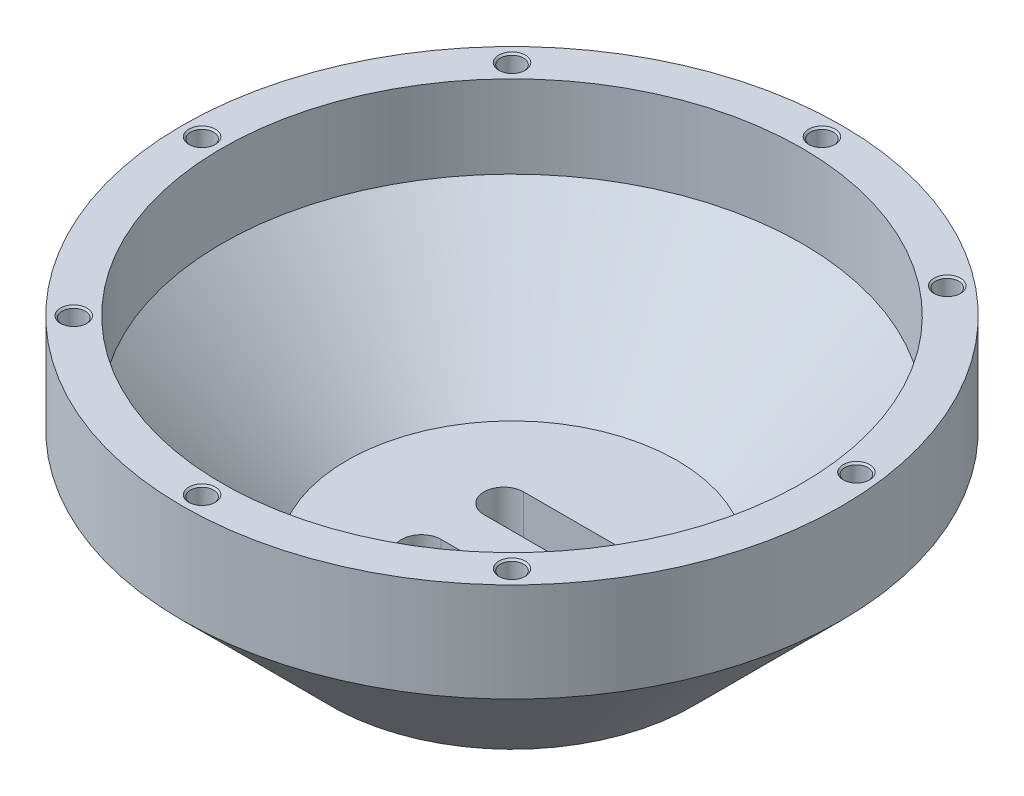
ISO-10303-21;
HEADER;
FILE_DESCRIPTION(('STEP AP214'),'2;1');
FILE_NAME('part.step','',(''),(''),'','','');
FILE_SCHEMA(('AUTOMOTIVE_DESIGN { 1 0 10303 214 1 1 1 1 }'));
ENDSEC;
DATA;
#1=APPLICATION_CONTEXT('core data for automotive mechanical design processes');
#2=APPLICATION_PROTOCOL_DEFINITION('international standard','automotive_design',2000,#1);
#3=PRODUCT_CONTEXT('',#1,'mechanical');
#4=PRODUCT('Part','Part','',(#3));
#5=PRODUCT_RELATED_PRODUCT_CATEGORY('part','',(#4));
#6=PRODUCT_DEFINITION_FORMATION('','',#4);
#7=PRODUCT_DEFINITION_CONTEXT('part definition',#1,'design');
#8=PRODUCT_DEFINITION('design','',#6,#7);
#9=PRODUCT_DEFINITION_SHAPE('','',#8);
#10=(LENGTH_UNIT() NAMED_UNIT(*) SI_UNIT(.MILLI.,.METRE.));
#11=(NAMED_UNIT(*) PLANE_ANGLE_UNIT() SI_UNIT($,.RADIAN.));
#12=(NAMED_UNIT(*) SI_UNIT($,.STERADIAN.) SOLID_ANGLE_UNIT());
#13=UNCERTAINTY_MEASURE_WITH_UNIT(LENGTH_MEASURE(1.E-05),#10,'distance_accuracy_value','');
#14=(GEOMETRIC_REPRESENTATION_CONTEXT(3) GLOBAL_UNCERTAINTY_ASSIGNED_CONTEXT((#13)) GLOBAL_UNIT_ASSIGNED_CONTEXT((#10,
#11,#12)) REPRESENTATION_CONTEXT('',''));
#15=CARTESIAN_POINT('',(0.,0.,0.));
#16=DIRECTION('',(0.,0.,1.));
#17=DIRECTION('',(1.,0.,0.));
#18=AXIS2_PLACEMENT_3D('',#15,#16,#17);
#19=CARTESIAN_POINT('',(0.,12.,0.));
#20=DIRECTION('',(0.,1.,0.));
#21=DIRECTION('',(0.,0.,1.));
#22=AXIS2_PLACEMENT_3D('',#19,#20,#21);
#23=PLANE('',#22);
#24=CARTESIAN_POINT('',(-15.,12.,12.5));
#25=DIRECTION('',(0.,1.,0.));
#26=DIRECTION('',(0.,0.,1.));
#27=AXIS2_PLACEMENT_3D('',#24,#25,#26);
#28=CIRCLE('',#27,5.99999999999999);
#29=CARTESIAN_POINT('',(-15.,12.,6.50000000000001));
#30=VERTEX_POINT('',#29);
#31=CARTESIAN_POINT('',(-15.,12.,18.5));
#32=VERTEX_POINT('',#31);
#33=EDGE_CURVE('E255',#30,#32,#28,.T.);
#34=ORIENTED_EDGE('',*,*,#33,.F.);
#35=DIRECTION('',(-1.,0.,0.));
#36=VECTOR('',#35,1.);
#37=CARTESIAN_POINT('',(0.,12.,6.50000000000001));
#38=LINE('',#37,#36);
#39=CARTESIAN_POINT('',(15.,12.,6.50000000000001));
#40=VERTEX_POINT('',#39);
#41=EDGE_CURVE('E249',#40,#30,#38,.T.);
#42=ORIENTED_EDGE('',*,*,#41,.F.);
#43=CARTESIAN_POINT('',(15.,12.,12.5));
#44=DIRECTION('',(0.,1.,0.));
#45=DIRECTION('',(0.,0.,1.));
#46=AXIS2_PLACEMENT_3D('',#43,#44,#45);
#47=CIRCLE('',#46,6.);
#48=CARTESIAN_POINT('',(15.,12.,18.5));
#49=VERTEX_POINT('',#48);
#50=EDGE_CURVE('E251',#49,#40,#47,.T.);
#51=ORIENTED_EDGE('',*,*,#50,.F.);
#52=DIRECTION('',(1.,0.,0.));
#53=VECTOR('',#52,1.);
#54=CARTESIAN_POINT('',(0.,12.,18.5));
#55=LINE('',#54,#53);
#56=EDGE_CURVE('E253',#32,#49,#55,.T.);
#57=ORIENTED_EDGE('',*,*,#56,.F.);
#58=EDGE_LOOP('',(#34,#42,#51,#57));
#59=FACE_BOUND('',#58,.T.);
#60=CARTESIAN_POINT('',(-15.,12.,-12.5));
#61=DIRECTION('',(0.,1.,0.));
#62=DIRECTION('',(0.,0.,1.));
#63=AXIS2_PLACEMENT_3D('',#60,#61,#62);
#64=CIRCLE('',#63,5.99999999999999);
#65=CARTESIAN_POINT('',(-15.,12.,-18.5));
#66=VERTEX_POINT('',#65);
#67=CARTESIAN_POINT('',(-15.,12.,-6.50000000000001));
#68=VERTEX_POINT('',#67);
#69=EDGE_CURVE('E247',#66,#68,#64,.T.);
#70=ORIENTED_EDGE('',*,*,#69,.F.);
#71=DIRECTION('',(-1.,0.,0.));
#72=VECTOR('',#71,1.);
#73=CARTESIAN_POINT('',(0.,12.,-18.5));
#74=LINE('',#73,#72);
#75=CARTESIAN_POINT('',(15.,12.,-18.5));
#76=VERTEX_POINT('',#75);
#77=EDGE_CURVE('E220',#76,#66,#74,.T.);
#78=ORIENTED_EDGE('',*,*,#77,.F.);
#79=CARTESIAN_POINT('',(15.,12.,-12.5));
#80=DIRECTION('',(0.,1.,0.));
#81=DIRECTION('',(0.,0.,1.));
#82=AXIS2_PLACEMENT_3D('',#79,#80,#81);
#83=CIRCLE('',#82,6.);
#84=CARTESIAN_POINT('',(15.,12.,-6.50000000000001));
#85=VERTEX_POINT('',#84);
#86=EDGE_CURVE('E243',#85,#76,#83,.T.);
#87=ORIENTED_EDGE('',*,*,#86,.F.);
#88=DIRECTION('',(1.,0.,0.));
#89=VECTOR('',#88,1.);
#90=CARTESIAN_POINT('',(0.,12.,-6.50000000000001));
#91=LINE('',#90,#89);
#92=EDGE_CURVE('E245',#68,#85,#91,.T.);
#93=ORIENTED_EDGE('',*,*,#92,.F.);
#94=EDGE_LOOP('',(#70,#78,#87,#93));
#95=FACE_BOUND('',#94,.T.);
#96=CARTESIAN_POINT('',(0.,12.,0.));
#97=DIRECTION('',(0.,-1.,0.));
#98=DIRECTION('',(0.,0.,-1.));
#99=AXIS2_PLACEMENT_3D('',#96,#97,#98);
#100=CIRCLE('',#99,50.0294372515226);
#101=CARTESIAN_POINT('',(0.,12.,-50.0294372515226));
#102=VERTEX_POINT('',#101);
#103=EDGE_CURVE('E11',#102,#102,#100,.T.);
#104=ORIENTED_EDGE('',*,*,#103,.F.);
#105=EDGE_LOOP('',(#104));
#106=FACE_BOUND('',#105,.T.);
#107=ADVANCED_FACE('F39',(#59,#95,#106),#23,.T.);
#108=CARTESIAN_POINT('',(0.,49.9705627484773,0.));
#109=DIRECTION('',(0.,1.,0.));
#110=DIRECTION('',(0.,0.,1.));
#111=AXIS2_PLACEMENT_3D('',#108,#109,#110);
#112=CONICAL_SURFACE('',#111,87.9999999999997,0.785398163397445);
#113=ORIENTED_EDGE('',*,*,#103,.T.);
#114=EDGE_LOOP('',(#113));
#115=FACE_BOUND('',#114,.T.);
#116=CARTESIAN_POINT('',(0.,49.9705627484773,0.));
#117=DIRECTION('',(0.,-1.,0.));
#118=DIRECTION('',(0.,0.,-1.));
#119=AXIS2_PLACEMENT_3D('',#116,#117,#118);
#120=CIRCLE('',#119,87.9999999999997);
#121=CARTESIAN_POINT('',(0.,49.9705627484773,-87.9999999999997));
#122=VERTEX_POINT('',#121);
#123=EDGE_CURVE('E46',#122,#122,#120,.T.);
#124=ORIENTED_EDGE('',*,*,#123,.F.);
#125=EDGE_LOOP('',(#124));
#126=FACE_BOUND('',#125,.T.);
#127=ADVANCED_FACE('F274',(#115,#126),#112,.F.);
#128=CARTESIAN_POINT('',(0.,0.,0.));
#129=DIRECTION('',(0.,-1.,0.));
#130=DIRECTION('',(0.,0.,-1.));
#131=AXIS2_PLACEMENT_3D('',#128,#129,#130);
#132=CYLINDRICAL_SURFACE('',#131,87.9999999999997);
#133=ORIENTED_EDGE('',*,*,#123,.T.);
#134=EDGE_LOOP('',(#133));
#135=FACE_BOUND('',#134,.T.);
#136=CARTESIAN_POINT('',(0.,75.,0.));
#137=DIRECTION('',(0.,-1.,0.));
#138=DIRECTION('',(0.,0.,-1.));
#139=AXIS2_PLACEMENT_3D('',#136,#137,#138);
#140=CIRCLE('',#139,87.9999999999997);
#141=CARTESIAN_POINT('',(0.,75.,-87.9999999999997));
#142=VERTEX_POINT('',#141);
#143=EDGE_CURVE('E266',#142,#142,#140,.T.);
#144=ORIENTED_EDGE('',*,*,#143,.F.);
#145=EDGE_LOOP('',(#144));
#146=FACE_BOUND('',#145,.T.);
#147=ADVANCED_FACE('F271',(#135,#146),#132,.F.);
#148=CARTESIAN_POINT('',(87.9999999999997,75.,0.));
#149=DIRECTION('',(0.,1.,0.));
#150=DIRECTION('',(0.,0.,1.));
#151=AXIS2_PLACEMENT_3D('',#148,#149,#150);
#152=PLANE('',#151);
#153=CARTESIAN_POINT('',(0.,75.,-94.));
#154=DIRECTION('',(0.,1.,0.));
#155=DIRECTION('',(0.,0.,1.));
#156=AXIS2_PLACEMENT_3D('',#153,#154,#155);
#157=CIRCLE('',#156,4.025);
#158=CARTESIAN_POINT('',(0.,75.,-89.975));
#159=VERTEX_POINT('',#158);
#160=EDGE_CURVE('E142',#159,#159,#157,.T.);
#161=ORIENTED_EDGE('',*,*,#160,.F.);
#162=EDGE_LOOP('',(#161));
#163=FACE_BOUND('',#162,.T.);
#164=CARTESIAN_POINT('',(58.1393957423018,75.,-73.8634595907883));
#165=DIRECTION('',(0.,1.,0.));
#166=DIRECTION('',(0.,0.,1.));
#167=AXIS2_PLACEMENT_3D('',#164,#165,#166);
#168=CIRCLE('',#167,4.025);
#169=CARTESIAN_POINT('',(58.1393957423018,75.,-69.8384595907883));
#170=VERTEX_POINT('',#169);
#171=EDGE_CURVE('E135',#170,#170,#168,.T.);
#172=ORIENTED_EDGE('',*,*,#171,.F.);
#173=EDGE_LOOP('',(#172));
#174=FACE_BOUND('',#173,.T.);
#175=CARTESIAN_POINT('',(93.3401141420148,75.,-11.1185921750749));
#176=DIRECTION('',(0.,1.,0.));
#177=DIRECTION('',(0.,0.,1.));
#178=AXIS2_PLACEMENT_3D('',#175,#176,#177);
#179=CIRCLE('',#178,4.025);
#180=CARTESIAN_POINT('',(93.3401141420148,75.,-7.09359217507488));
#181=VERTEX_POINT('',#180);
#182=EDGE_CURVE('E151',#181,#181,#179,.T.);
#183=ORIENTED_EDGE('',*,*,#182,.F.);
#184=EDGE_LOOP('',(#183));
#185=FACE_BOUND('',#184,.T.);
#186=CARTESIAN_POINT('',(66.4680374315342,75.,66.4680374315367));
#187=DIRECTION('',(0.,1.,0.));
#188=DIRECTION('',(0.,0.,1.));
#189=AXIS2_PLACEMENT_3D('',#186,#187,#188);
#190=CIRCLE('',#189,4.025);
#191=CARTESIAN_POINT('',(66.4680374315342,75.,70.4930374315367));
#192=VERTEX_POINT('',#191);
#193=EDGE_CURVE('E160',#192,#192,#190,.T.);
#194=ORIENTED_EDGE('',*,*,#193,.F.);
#195=EDGE_LOOP('',(#194));
#196=FACE_BOUND('',#195,.T.);
#197=CARTESIAN_POINT('',(-1.29063426612674E-12,75.,94.));
#198=DIRECTION('',(0.,1.,0.));
#199=DIRECTION('',(0.,0.,1.));
#200=AXIS2_PLACEMENT_3D('',#197,#198,#199);
#201=CIRCLE('',#200,4.025);
#202=CARTESIAN_POINT('',(-1.29063426612674E-12,75.,98.025));
#203=VERTEX_POINT('',#202);
#204=EDGE_CURVE('E169',#203,#203,#201,.T.);
#205=ORIENTED_EDGE('',*,*,#204,.F.);
#206=EDGE_LOOP('',(#205));
#207=FACE_BOUND('',#206,.T.);
#208=CARTESIAN_POINT('',(-66.468037431536,75.,66.4680374315349));
#209=DIRECTION('',(0.,1.,0.));
#210=DIRECTION('',(0.,0.,1.));
#211=AXIS2_PLACEMENT_3D('',#208,#209,#210);
#212=CIRCLE('',#211,4.025);
#213=CARTESIAN_POINT('',(-66.468037431536,75.,70.4930374315349));
#214=VERTEX_POINT('',#213);
#215=EDGE_CURVE('E178',#214,#214,#212,.T.);
#216=ORIENTED_EDGE('',*,*,#215,.F.);
#217=EDGE_LOOP('',(#216));
#218=FACE_BOUND('',#217,.T.);
#219=CARTESIAN_POINT('',(-94.,75.,-2.91433543964104E-13));
#220=DIRECTION('',(0.,1.,0.));
#221=DIRECTION('',(0.,0.,1.));
#222=AXIS2_PLACEMENT_3D('',#219,#220,#221);
#223=CIRCLE('',#222,4.025);
#224=CARTESIAN_POINT('',(-94.,75.,4.02499999999971));
#225=VERTEX_POINT('',#224);
#226=EDGE_CURVE('E187',#225,#225,#223,.T.);
#227=ORIENTED_EDGE('',*,*,#226,.F.);
#228=EDGE_LOOP('',(#227));
#229=FACE_BOUND('',#228,.T.);
#230=CARTESIAN_POINT('',(-66.4680374315356,75.,-66.4680374315353));
#231=DIRECTION('',(0.,1.,0.));
#232=DIRECTION('',(0.,0.,1.));
#233=AXIS2_PLACEMENT_3D('',#230,#231,#232);
#234=CIRCLE('',#233,4.025);
#235=CARTESIAN_POINT('',(-66.4680374315356,75.,-62.4430374315353));
#236=VERTEX_POINT('',#235);
#237=EDGE_CURVE('E196',#236,#236,#234,.T.);
#238=ORIENTED_EDGE('',*,*,#237,.F.);
#239=EDGE_LOOP('',(#238));
#240=FACE_BOUND('',#239,.T.);
#241=ORIENTED_EDGE('',*,*,#143,.T.);
#242=EDGE_LOOP('',(#241));
#243=FACE_BOUND('',#242,.T.);
#244=CARTESIAN_POINT('',(0.,75.,0.));
#245=DIRECTION('',(0.,-1.,0.));
#246=DIRECTION('',(0.,0.,-1.));
#247=AXIS2_PLACEMENT_3D('',#244,#245,#246);
#248=CIRCLE('',#247,100.);
#249=CARTESIAN_POINT('',(0.,75.,-100.));
#250=VERTEX_POINT('',#249);
#251=EDGE_CURVE('E263',#250,#250,#248,.T.);
#252=ORIENTED_EDGE('',*,*,#251,.F.);
#253=EDGE_LOOP('',(#252));
#254=FACE_BOUND('',#253,.T.);
#255=ADVANCED_FACE('F281',(#163,#174,#185,#196,#207,#218,#229,#240,#243,#254),#152,.T.);
#256=CARTESIAN_POINT('',(0.,0.,0.));
#257=DIRECTION('',(0.,-1.,0.));
#258=DIRECTION('',(0.,0.,-1.));
#259=AXIS2_PLACEMENT_3D('',#256,#257,#258);
#260=CYLINDRICAL_SURFACE('',#259,100.);
#261=ORIENTED_EDGE('',*,*,#251,.T.);
#262=EDGE_LOOP('',(#261));
#263=FACE_BOUND('',#262,.T.);
#264=CARTESIAN_POINT('',(0.,44.9999999999996,0.));
#265=DIRECTION('',(0.,-1.,0.));
#266=DIRECTION('',(0.,0.,-1.));
#267=AXIS2_PLACEMENT_3D('',#264,#265,#266);
#268=CIRCLE('',#267,100.);
#269=CARTESIAN_POINT('',(0.,44.9999999999996,-100.));
#270=VERTEX_POINT('',#269);
#271=EDGE_CURVE('E260',#270,#270,#268,.T.);
#272=ORIENTED_EDGE('',*,*,#271,.F.);
#273=EDGE_LOOP('',(#272));
#274=FACE_BOUND('',#273,.T.);
#275=ADVANCED_FACE('F287',(#263,#274),#260,.T.);
#276=CARTESIAN_POINT('',(0.,0.,0.));
#277=DIRECTION('',(0.,1.,0.));
#278=DIRECTION('',(0.,0.,1.));
#279=AXIS2_PLACEMENT_3D('',#276,#277,#278);
#280=CONICAL_SURFACE('',#279,55.,0.785398163397453);
#281=ORIENTED_EDGE('',*,*,#271,.T.);
#282=EDGE_LOOP('',(#281));
#283=FACE_BOUND('',#282,.T.);
#284=CARTESIAN_POINT('',(0.,0.,0.));
#285=DIRECTION('',(0.,-1.,0.));
#286=DIRECTION('',(0.,0.,-1.));
#287=AXIS2_PLACEMENT_3D('',#284,#285,#286);
#288=CIRCLE('',#287,55.);
#289=CARTESIAN_POINT('',(0.,0.,-55.));
#290=VERTEX_POINT('',#289);
#291=EDGE_CURVE('E257',#290,#290,#288,.T.);
#292=ORIENTED_EDGE('',*,*,#291,.F.);
#293=EDGE_LOOP('',(#292));
#294=FACE_BOUND('',#293,.T.);
#295=ADVANCED_FACE('F291',(#283,#294),#280,.T.);
#296=CARTESIAN_POINT('',(0.,0.,0.));
#297=DIRECTION('',(0.,-1.,0.));
#298=DIRECTION('',(0.,0.,-1.));
#299=AXIS2_PLACEMENT_3D('',#296,#297,#298);
#300=PLANE('',#299);
#301=CARTESIAN_POINT('',(-15.,0.,12.5));
#302=DIRECTION('',(0.,-1.,0.));
#303=DIRECTION('',(0.,0.,1.));
#304=AXIS2_PLACEMENT_3D('',#301,#302,#303);
#305=CIRCLE('',#304,5.99999999999999);
#306=CARTESIAN_POINT('',(-15.,0.,18.5));
#307=VERTEX_POINT('',#306);
#308=CARTESIAN_POINT('',(-15.,0.,6.50000000000001));
#309=VERTEX_POINT('',#308);
#310=EDGE_CURVE('E206',#307,#309,#305,.T.);
#311=ORIENTED_EDGE('',*,*,#310,.F.);
#312=DIRECTION('',(-1.,0.,0.));
#313=VECTOR('',#312,1.);
#314=CARTESIAN_POINT('',(-15.,0.,18.5));
#315=LINE('',#314,#313);
#316=CARTESIAN_POINT('',(15.,0.,18.5));
#317=VERTEX_POINT('',#316);
#318=EDGE_CURVE('E214',#317,#307,#315,.T.);
#319=ORIENTED_EDGE('',*,*,#318,.F.);
#320=CARTESIAN_POINT('',(15.,0.,12.5));
#321=DIRECTION('',(0.,-1.,0.));
#322=DIRECTION('',(0.,0.,1.));
#323=AXIS2_PLACEMENT_3D('',#320,#321,#322);
#324=CIRCLE('',#323,6.);
#325=CARTESIAN_POINT('',(15.,0.,6.50000000000001));
#326=VERTEX_POINT('',#325);
#327=EDGE_CURVE('E211',#326,#317,#324,.T.);
#328=ORIENTED_EDGE('',*,*,#327,.F.);
#329=DIRECTION('',(1.,0.,0.));
#330=VECTOR('',#329,1.);
#331=CARTESIAN_POINT('',(-15.,0.,6.50000000000001));
#332=LINE('',#331,#330);
#333=EDGE_CURVE('E208',#309,#326,#332,.T.);
#334=ORIENTED_EDGE('',*,*,#333,.F.);
#335=EDGE_LOOP('',(#311,#319,#328,#334));
#336=FACE_BOUND('',#335,.T.);
#337=CARTESIAN_POINT('',(-15.,0.,-12.5));
#338=DIRECTION('',(0.,-1.,0.));
#339=DIRECTION('',(0.,0.,1.));
#340=AXIS2_PLACEMENT_3D('',#337,#338,#339);
#341=CIRCLE('',#340,5.99999999999999);
#342=CARTESIAN_POINT('',(-15.,0.,-6.50000000000001));
#343=VERTEX_POINT('',#342);
#344=CARTESIAN_POINT('',(-15.,0.,-18.5));
#345=VERTEX_POINT('',#344);
#346=EDGE_CURVE('E205',#343,#345,#341,.T.);
#347=ORIENTED_EDGE('',*,*,#346,.F.);
#348=DIRECTION('',(-1.,0.,0.));
#349=VECTOR('',#348,1.);
#350=CARTESIAN_POINT('',(-15.,0.,-6.50000000000001));
#351=LINE('',#350,#349);
#352=CARTESIAN_POINT('',(15.,0.,-6.50000000000001));
#353=VERTEX_POINT('',#352);
#354=EDGE_CURVE('E232',#353,#343,#351,.T.);
#355=ORIENTED_EDGE('',*,*,#354,.F.);
#356=CARTESIAN_POINT('',(15.,0.,-12.5));
#357=DIRECTION('',(0.,-1.,0.));
#358=DIRECTION('',(0.,0.,1.));
#359=AXIS2_PLACEMENT_3D('',#356,#357,#358);
#360=CIRCLE('',#359,6.);
#361=CARTESIAN_POINT('',(15.,0.,-18.5));
#362=VERTEX_POINT('',#361);
#363=EDGE_CURVE('E229',#362,#353,#360,.T.);
#364=ORIENTED_EDGE('',*,*,#363,.F.);
#365=DIRECTION('',(1.,0.,0.));
#366=VECTOR('',#365,1.);
#367=CARTESIAN_POINT('',(-15.,0.,-18.5));
#368=LINE('',#367,#366);
#369=EDGE_CURVE('E227',#345,#362,#368,.T.);
#370=ORIENTED_EDGE('',*,*,#369,.F.);
#371=EDGE_LOOP('',(#347,#355,#364,#370));
#372=FACE_BOUND('',#371,.T.);
#373=ORIENTED_EDGE('',*,*,#291,.T.);
#374=EDGE_LOOP('',(#373));
#375=FACE_BOUND('',#374,.T.);
#376=ADVANCED_FACE('F295',(#336,#372,#375),#300,.T.);
#377=CARTESIAN_POINT('',(-15.,75.,-12.5));
#378=DIRECTION('',(0.,-1.,0.));
#379=DIRECTION('',(0.,0.,-1.));
#380=AXIS2_PLACEMENT_3D('',#377,#378,#379);
#381=CYLINDRICAL_SURFACE('',#380,5.99999999999999);
#382=ORIENTED_EDGE('',*,*,#69,.T.);
#383=DIRECTION('',(0.,-1.,0.));
#384=VECTOR('',#383,1.);
#385=CARTESIAN_POINT('',(-15.,75.,-6.50000000000001));
#386=LINE('',#385,#384);
#387=EDGE_CURVE('E209',#68,#343,#386,.T.);
#388=ORIENTED_EDGE('',*,*,#387,.T.);
#389=ORIENTED_EDGE('',*,*,#346,.T.);
#390=DIRECTION('',(0.,-1.,0.));
#391=VECTOR('',#390,1.);
#392=CARTESIAN_POINT('',(-15.,75.,-18.5));
#393=LINE('',#392,#391);
#394=EDGE_CURVE('E235',#66,#345,#393,.T.);
#395=ORIENTED_EDGE('',*,*,#394,.F.);
#396=EDGE_LOOP('',(#382,#388,#389,#395));
#397=FACE_BOUND('',#396,.T.);
#398=ADVANCED_FACE('F299',(#397),#381,.F.);
#399=CARTESIAN_POINT('',(-15.,75.,-6.50000000000001));
#400=DIRECTION('',(0.,0.,1.));
#401=DIRECTION('',(1.,0.,0.));
#402=AXIS2_PLACEMENT_3D('',#399,#400,#401);
#403=PLANE('',#402);
#404=ORIENTED_EDGE('',*,*,#92,.T.);
#405=DIRECTION('',(0.,-1.,0.));
#406=VECTOR('',#405,1.);
#407=CARTESIAN_POINT('',(15.,75.,-6.50000000000001));
#408=LINE('',#407,#406);
#409=EDGE_CURVE('E237',#85,#353,#408,.T.);
#410=ORIENTED_EDGE('',*,*,#409,.T.);
#411=ORIENTED_EDGE('',*,*,#354,.T.);
#412=ORIENTED_EDGE('',*,*,#387,.F.);
#413=EDGE_LOOP('',(#404,#410,#411,#412));
#414=FACE_BOUND('',#413,.T.);
#415=ADVANCED_FACE('F303',(#414),#403,.F.);
#416=CARTESIAN_POINT('',(15.,75.,-12.5));
#417=DIRECTION('',(0.,-1.,0.));
#418=DIRECTION('',(0.,0.,-1.));
#419=AXIS2_PLACEMENT_3D('',#416,#417,#418);
#420=CYLINDRICAL_SURFACE('',#419,6.);
#421=ORIENTED_EDGE('',*,*,#86,.T.);
#422=DIRECTION('',(0.,-1.,0.));
#423=VECTOR('',#422,1.);
#424=CARTESIAN_POINT('',(15.,75.,-18.5));
#425=LINE('',#424,#423);
#426=EDGE_CURVE('E61',#76,#362,#425,.T.);
#427=ORIENTED_EDGE('',*,*,#426,.T.);
#428=ORIENTED_EDGE('',*,*,#363,.T.);
#429=ORIENTED_EDGE('',*,*,#409,.F.);
#430=EDGE_LOOP('',(#421,#427,#428,#429));
#431=FACE_BOUND('',#430,.T.);
#432=ADVANCED_FACE('F309',(#431),#420,.F.);
#433=CARTESIAN_POINT('',(-15.,75.,-18.5));
#434=DIRECTION('',(0.,0.,-1.));
#435=DIRECTION('',(-1.,0.,0.));
#436=AXIS2_PLACEMENT_3D('',#433,#434,#435);
#437=PLANE('',#436);
#438=ORIENTED_EDGE('',*,*,#77,.T.);
#439=ORIENTED_EDGE('',*,*,#394,.T.);
#440=ORIENTED_EDGE('',*,*,#369,.T.);
#441=ORIENTED_EDGE('',*,*,#426,.F.);
#442=EDGE_LOOP('',(#438,#439,#440,#441));
#443=FACE_BOUND('',#442,.T.);
#444=ADVANCED_FACE('F305',(#443),#437,.F.);
#445=CARTESIAN_POINT('',(-15.,75.,12.5));
#446=DIRECTION('',(0.,-1.,0.));
#447=DIRECTION('',(0.,0.,-1.));
#448=AXIS2_PLACEMENT_3D('',#445,#446,#447);
#449=CYLINDRICAL_SURFACE('',#448,5.99999999999999);
#450=ORIENTED_EDGE('',*,*,#33,.T.);
#451=DIRECTION('',(0.,-1.,0.));
#452=VECTOR('',#451,1.);
#453=CARTESIAN_POINT('',(-15.,75.,18.5));
#454=LINE('',#453,#452);
#455=EDGE_CURVE('E218',#32,#307,#454,.T.);
#456=ORIENTED_EDGE('',*,*,#455,.T.);
#457=ORIENTED_EDGE('',*,*,#310,.T.);
#458=DIRECTION('',(0.,-1.,0.));
#459=VECTOR('',#458,1.);
#460=CARTESIAN_POINT('',(-15.,75.,6.50000000000001));
#461=LINE('',#460,#459);
#462=EDGE_CURVE('E217',#30,#309,#461,.T.);
#463=ORIENTED_EDGE('',*,*,#462,.F.);
#464=EDGE_LOOP('',(#450,#456,#457,#463));
#465=FACE_BOUND('',#464,.T.);
#466=ADVANCED_FACE('F308',(#465),#449,.F.);
#467=CARTESIAN_POINT('',(-15.,75.,18.5));
#468=DIRECTION('',(0.,0.,1.));
#469=DIRECTION('',(1.,0.,0.));
#470=AXIS2_PLACEMENT_3D('',#467,#468,#469);
#471=PLANE('',#470);
#472=ORIENTED_EDGE('',*,*,#56,.T.);
#473=DIRECTION('',(0.,-1.,0.));
#474=VECTOR('',#473,1.);
#475=CARTESIAN_POINT('',(15.,75.,18.5));
#476=LINE('',#475,#474);
#477=EDGE_CURVE('E221',#49,#317,#476,.T.);
#478=ORIENTED_EDGE('',*,*,#477,.T.);
#479=ORIENTED_EDGE('',*,*,#318,.T.);
#480=ORIENTED_EDGE('',*,*,#455,.F.);
#481=EDGE_LOOP('',(#472,#478,#479,#480));
#482=FACE_BOUND('',#481,.T.);
#483=ADVANCED_FACE('F318',(#482),#471,.F.);
#484=CARTESIAN_POINT('',(15.,75.,12.5));
#485=DIRECTION('',(0.,-1.,0.));
#486=DIRECTION('',(0.,0.,-1.));
#487=AXIS2_PLACEMENT_3D('',#484,#485,#486);
#488=CYLINDRICAL_SURFACE('',#487,6.);
#489=ORIENTED_EDGE('',*,*,#50,.T.);
#490=DIRECTION('',(0.,-1.,0.));
#491=VECTOR('',#490,1.);
#492=CARTESIAN_POINT('',(15.,75.,6.50000000000001));
#493=LINE('',#492,#491);
#494=EDGE_CURVE('E53',#40,#326,#493,.T.);
#495=ORIENTED_EDGE('',*,*,#494,.T.);
#496=ORIENTED_EDGE('',*,*,#327,.T.);
#497=ORIENTED_EDGE('',*,*,#477,.F.);
#498=EDGE_LOOP('',(#489,#495,#496,#497));
#499=FACE_BOUND('',#498,.T.);
#500=ADVANCED_FACE('F324',(#499),#488,.F.);
#501=CARTESIAN_POINT('',(-15.,75.,6.50000000000001));
#502=DIRECTION('',(0.,0.,-1.));
#503=DIRECTION('',(-1.,0.,0.));
#504=AXIS2_PLACEMENT_3D('',#501,#502,#503);
#505=PLANE('',#504);
#506=ORIENTED_EDGE('',*,*,#41,.T.);
#507=ORIENTED_EDGE('',*,*,#462,.T.);
#508=ORIENTED_EDGE('',*,*,#333,.T.);
#509=ORIENTED_EDGE('',*,*,#494,.F.);
#510=EDGE_LOOP('',(#506,#507,#508,#509));
#511=FACE_BOUND('',#510,.T.);
#512=ADVANCED_FACE('F320',(#511),#505,.F.);
#513=CARTESIAN_POINT('',(-66.4680374315356,54.,-66.4680374315353));
#514=DIRECTION('',(0.,1.,0.));
#515=DIRECTION('',(0.,0.,1.));
#516=AXIS2_PLACEMENT_3D('',#513,#514,#515);
#517=CONICAL_SURFACE('',#516,3.49999999999999,1.02974425867665);
#518=CARTESIAN_POINT('',(-66.4680374315356,51.8969878334035,-66.4680374315353));
#519=VERTEX_POINT('',#518);
#520=VERTEX_LOOP('',#519);
#521=FACE_BOUND('',#520,.T.);
#522=CARTESIAN_POINT('',(-66.4680374315356,54.,-66.4680374315353));
#523=DIRECTION('',(0.,1.,0.));
#524=DIRECTION('',(0.,0.,1.));
#525=AXIS2_PLACEMENT_3D('',#522,#523,#524);
#526=CIRCLE('',#525,3.49999999999999);
#527=CARTESIAN_POINT('',(-66.4680374315356,54.,-62.9680374315353));
#528=VERTEX_POINT('',#527);
#529=EDGE_CURVE('E202',#528,#528,#526,.T.);
#530=ORIENTED_EDGE('',*,*,#529,.T.);
#531=EDGE_LOOP('',(#530));
#532=FACE_BOUND('',#531,.T.);
#533=ADVANCED_FACE('F323',(#521,#532),#517,.F.);
#534=CARTESIAN_POINT('',(-66.4680374315356,75.,-66.4680374315353));
#535=DIRECTION('',(0.,1.,0.));
#536=DIRECTION('',(0.,0.,1.));
#537=AXIS2_PLACEMENT_3D('',#534,#535,#536);
#538=CYLINDRICAL_SURFACE('',#537,3.5);
#539=ORIENTED_EDGE('',*,*,#529,.F.);
#540=EDGE_LOOP('',(#539));
#541=FACE_BOUND('',#540,.T.);
#542=CARTESIAN_POINT('',(-66.4680374315356,74.475,-66.4680374315353));
#543=DIRECTION('',(0.,1.,0.));
#544=DIRECTION('',(0.,0.,1.));
#545=AXIS2_PLACEMENT_3D('',#542,#543,#544);
#546=CIRCLE('',#545,3.5);
#547=CARTESIAN_POINT('',(-66.4680374315356,74.475,-62.9680374315353));
#548=VERTEX_POINT('',#547);
#549=EDGE_CURVE('E199',#548,#548,#546,.T.);
#550=ORIENTED_EDGE('',*,*,#549,.T.);
#551=EDGE_LOOP('',(#550));
#552=FACE_BOUND('',#551,.T.);
#553=ADVANCED_FACE('F333',(#541,#552),#538,.F.);
#554=CARTESIAN_POINT('',(-66.4680374315356,75.,-66.4680374315353));
#555=DIRECTION('',(0.,1.,0.));
#556=DIRECTION('',(0.,0.,1.));
#557=AXIS2_PLACEMENT_3D('',#554,#555,#556);
#558=CONICAL_SURFACE('',#557,4.025,0.785398163397435);
#559=ORIENTED_EDGE('',*,*,#549,.F.);
#560=EDGE_LOOP('',(#559));
#561=FACE_BOUND('',#560,.T.);
#562=ORIENTED_EDGE('',*,*,#237,.T.);
#563=EDGE_LOOP('',(#562));
#564=FACE_BOUND('',#563,.T.);
#565=ADVANCED_FACE('F337',(#561,#564),#558,.F.);
#566=CARTESIAN_POINT('',(-94.,54.,-2.91433543964104E-13));
#567=DIRECTION('',(0.,1.,0.));
#568=DIRECTION('',(0.,0.,1.));
#569=AXIS2_PLACEMENT_3D('',#566,#567,#568);
#570=CONICAL_SURFACE('',#569,3.49999999999999,1.02974425867665);
#571=CARTESIAN_POINT('',(-94.,51.8969878334035,-2.91433543964104E-13));
#572=VERTEX_POINT('',#571);
#573=VERTEX_LOOP('',#572);
#574=FACE_BOUND('',#573,.T.);
#575=CARTESIAN_POINT('',(-94.,54.,-2.91433543964104E-13));
#576=DIRECTION('',(0.,1.,0.));
#577=DIRECTION('',(0.,0.,1.));
#578=AXIS2_PLACEMENT_3D('',#575,#576,#577);
#579=CIRCLE('',#578,3.49999999999999);
#580=CARTESIAN_POINT('',(-94.,54.,3.4999999999997));
#581=VERTEX_POINT('',#580);
#582=EDGE_CURVE('E193',#581,#581,#579,.T.);
#583=ORIENTED_EDGE('',*,*,#582,.T.);
#584=EDGE_LOOP('',(#583));
#585=FACE_BOUND('',#584,.T.);
#586=ADVANCED_FACE('F341',(#574,#585),#570,.F.);
#587=CARTESIAN_POINT('',(-94.,75.,-2.91433543964104E-13));
#588=DIRECTION('',(0.,1.,0.));
#589=DIRECTION('',(0.,0.,1.));
#590=AXIS2_PLACEMENT_3D('',#587,#588,#589);
#591=CYLINDRICAL_SURFACE('',#590,3.5);
#592=ORIENTED_EDGE('',*,*,#582,.F.);
#593=EDGE_LOOP('',(#592));
#594=FACE_BOUND('',#593,.T.);
#595=CARTESIAN_POINT('',(-94.,74.475,-2.91433543964104E-13));
#596=DIRECTION('',(0.,1.,0.));
#597=DIRECTION('',(0.,0.,1.));
#598=AXIS2_PLACEMENT_3D('',#595,#596,#597);
#599=CIRCLE('',#598,3.5);
#600=CARTESIAN_POINT('',(-94.,74.475,3.49999999999971));
#601=VERTEX_POINT('',#600);
#602=EDGE_CURVE('E190',#601,#601,#599,.T.);
#603=ORIENTED_EDGE('',*,*,#602,.T.);
#604=EDGE_LOOP('',(#603));
#605=FACE_BOUND('',#604,.T.);
#606=ADVANCED_FACE('F345',(#594,#605),#591,.F.);
#607=CARTESIAN_POINT('',(-94.,75.,-2.91433543964104E-13));
#608=DIRECTION('',(0.,1.,0.));
#609=DIRECTION('',(0.,0.,1.));
#610=AXIS2_PLACEMENT_3D('',#607,#608,#609);
#611=CONICAL_SURFACE('',#610,4.025,0.785398163397435);
#612=ORIENTED_EDGE('',*,*,#602,.F.);
#613=EDGE_LOOP('',(#612));
#614=FACE_BOUND('',#613,.T.);
#615=ORIENTED_EDGE('',*,*,#226,.T.);
#616=EDGE_LOOP('',(#615));
#617=FACE_BOUND('',#616,.T.);
#618=ADVANCED_FACE('F349',(#614,#617),#611,.F.);
#619=CARTESIAN_POINT('',(-66.468037431536,54.,66.4680374315349));
#620=DIRECTION('',(0.,1.,0.));
#621=DIRECTION('',(0.,0.,1.));
#622=AXIS2_PLACEMENT_3D('',#619,#620,#621);
#623=CONICAL_SURFACE('',#622,3.49999999999999,1.02974425867665);
#624=CARTESIAN_POINT('',(-66.468037431536,51.8969878334035,66.4680374315349));
#625=VERTEX_POINT('',#624);
#626=VERTEX_LOOP('',#625);
#627=FACE_BOUND('',#626,.T.);
#628=CARTESIAN_POINT('',(-66.468037431536,54.,66.4680374315349));
#629=DIRECTION('',(0.,1.,0.));
#630=DIRECTION('',(0.,0.,1.));
#631=AXIS2_PLACEMENT_3D('',#628,#629,#630);
#632=CIRCLE('',#631,3.49999999999999);
#633=CARTESIAN_POINT('',(-66.468037431536,54.,69.9680374315349));
#634=VERTEX_POINT('',#633);
#635=EDGE_CURVE('E184',#634,#634,#632,.T.);
#636=ORIENTED_EDGE('',*,*,#635,.T.);
#637=EDGE_LOOP('',(#636));
#638=FACE_BOUND('',#637,.T.);
#639=ADVANCED_FACE('F353',(#627,#638),#623,.F.);
#640=CARTESIAN_POINT('',(-66.468037431536,75.,66.4680374315349));
#641=DIRECTION('',(0.,1.,0.));
#642=DIRECTION('',(0.,0.,1.));
#643=AXIS2_PLACEMENT_3D('',#640,#641,#642);
#644=CYLINDRICAL_SURFACE('',#643,3.5);
#645=ORIENTED_EDGE('',*,*,#635,.F.);
#646=EDGE_LOOP('',(#645));
#647=FACE_BOUND('',#646,.T.);
#648=CARTESIAN_POINT('',(-66.468037431536,74.475,66.4680374315349));
#649=DIRECTION('',(0.,1.,0.));
#650=DIRECTION('',(0.,0.,1.));
#651=AXIS2_PLACEMENT_3D('',#648,#649,#650);
#652=CIRCLE('',#651,3.5);
#653=CARTESIAN_POINT('',(-66.468037431536,74.475,69.9680374315349));
#654=VERTEX_POINT('',#653);
#655=EDGE_CURVE('E181',#654,#654,#652,.T.);
#656=ORIENTED_EDGE('',*,*,#655,.T.);
#657=EDGE_LOOP('',(#656));
#658=FACE_BOUND('',#657,.T.);
#659=ADVANCED_FACE('F357',(#647,#658),#644,.F.);
#660=CARTESIAN_POINT('',(-66.468037431536,75.,66.4680374315349));
#661=DIRECTION('',(0.,1.,0.));
#662=DIRECTION('',(0.,0.,1.));
#663=AXIS2_PLACEMENT_3D('',#660,#661,#662);
#664=CONICAL_SURFACE('',#663,4.025,0.785398163397435);
#665=ORIENTED_EDGE('',*,*,#655,.F.);
#666=EDGE_LOOP('',(#665));
#667=FACE_BOUND('',#666,.T.);
#668=ORIENTED_EDGE('',*,*,#215,.T.);
#669=EDGE_LOOP('',(#668));
#670=FACE_BOUND('',#669,.T.);
#671=ADVANCED_FACE('F361',(#667,#670),#664,.F.);
#672=CARTESIAN_POINT('',(-1.29063426612674E-12,54.,94.));
#673=DIRECTION('',(0.,1.,0.));
#674=DIRECTION('',(0.,0.,1.));
#675=AXIS2_PLACEMENT_3D('',#672,#673,#674);
#676=CONICAL_SURFACE('',#675,3.49999999999999,1.02974425867665);
#677=CARTESIAN_POINT('',(-1.29629287210684E-12,51.8969878334035,94.));
#678=VERTEX_POINT('',#677);
#679=VERTEX_LOOP('',#678);
#680=FACE_BOUND('',#679,.T.);
#681=CARTESIAN_POINT('',(-1.29063426612674E-12,54.,94.));
#682=DIRECTION('',(0.,1.,0.));
#683=DIRECTION('',(0.,0.,1.));
#684=AXIS2_PLACEMENT_3D('',#681,#682,#683);
#685=CIRCLE('',#684,3.49999999999999);
#686=CARTESIAN_POINT('',(-1.29063426612674E-12,54.,97.5));
#687=VERTEX_POINT('',#686);
#688=EDGE_CURVE('E175',#687,#687,#685,.T.);
#689=ORIENTED_EDGE('',*,*,#688,.T.);
#690=EDGE_LOOP('',(#689));
#691=FACE_BOUND('',#690,.T.);
#692=ADVANCED_FACE('F365',(#680,#691),#676,.F.);
#693=CARTESIAN_POINT('',(-1.29063426612674E-12,75.,94.));
#694=DIRECTION('',(0.,1.,0.));
#695=DIRECTION('',(0.,0.,1.));
#696=AXIS2_PLACEMENT_3D('',#693,#694,#695);
#697=CYLINDRICAL_SURFACE('',#696,3.49999999999999);
#698=ORIENTED_EDGE('',*,*,#688,.F.);
#699=EDGE_LOOP('',(#698));
#700=FACE_BOUND('',#699,.T.);
#701=CARTESIAN_POINT('',(-1.29063426612674E-12,74.475,94.));
#702=DIRECTION('',(0.,1.,0.));
#703=DIRECTION('',(0.,0.,1.));
#704=AXIS2_PLACEMENT_3D('',#701,#702,#703);
#705=CIRCLE('',#704,3.5);
#706=CARTESIAN_POINT('',(-1.29063426612674E-12,74.475,97.5));
#707=VERTEX_POINT('',#706);
#708=EDGE_CURVE('E172',#707,#707,#705,.T.);
#709=ORIENTED_EDGE('',*,*,#708,.T.);
#710=EDGE_LOOP('',(#709));
#711=FACE_BOUND('',#710,.T.);
#712=ADVANCED_FACE('F369',(#700,#711),#697,.F.);
#713=CARTESIAN_POINT('',(-1.29063426612674E-12,75.,94.));
#714=DIRECTION('',(0.,1.,0.));
#715=DIRECTION('',(0.,0.,1.));
#716=AXIS2_PLACEMENT_3D('',#713,#714,#715);
#717=CONICAL_SURFACE('',#716,4.025,0.785398163397441);
#718=ORIENTED_EDGE('',*,*,#708,.F.);
#719=EDGE_LOOP('',(#718));
#720=FACE_BOUND('',#719,.T.);
#721=ORIENTED_EDGE('',*,*,#204,.T.);
#722=EDGE_LOOP('',(#721));
#723=FACE_BOUND('',#722,.T.);
#724=ADVANCED_FACE('F373',(#720,#723),#717,.F.);
#725=CARTESIAN_POINT('',(66.4680374315342,54.,66.4680374315367));
#726=DIRECTION('',(0.,1.,0.));
#727=DIRECTION('',(0.,0.,1.));
#728=AXIS2_PLACEMENT_3D('',#725,#726,#727);
#729=CONICAL_SURFACE('',#728,3.49999999999999,1.02974425867665);
#730=CARTESIAN_POINT('',(66.4680374315342,51.8969878334035,66.4680374315367));
#731=VERTEX_POINT('',#730);
#732=VERTEX_LOOP('',#731);
#733=FACE_BOUND('',#732,.T.);
#734=CARTESIAN_POINT('',(66.4680374315342,54.,66.4680374315367));
#735=DIRECTION('',(0.,1.,0.));
#736=DIRECTION('',(0.,0.,1.));
#737=AXIS2_PLACEMENT_3D('',#734,#735,#736);
#738=CIRCLE('',#737,3.49999999999999);
#739=CARTESIAN_POINT('',(66.4680374315342,54.,69.9680374315367));
#740=VERTEX_POINT('',#739);
#741=EDGE_CURVE('E166',#740,#740,#738,.T.);
#742=ORIENTED_EDGE('',*,*,#741,.T.);
#743=EDGE_LOOP('',(#742));
#744=FACE_BOUND('',#743,.T.);
#745=ADVANCED_FACE('F377',(#733,#744),#729,.F.);
#746=CARTESIAN_POINT('',(66.4680374315342,75.,66.4680374315367));
#747=DIRECTION('',(0.,1.,0.));
#748=DIRECTION('',(0.,0.,1.));
#749=AXIS2_PLACEMENT_3D('',#746,#747,#748);
#750=CYLINDRICAL_SURFACE('',#749,3.5);
#751=ORIENTED_EDGE('',*,*,#741,.F.);
#752=EDGE_LOOP('',(#751));
#753=FACE_BOUND('',#752,.T.);
#754=CARTESIAN_POINT('',(66.4680374315342,74.475,66.4680374315367));
#755=DIRECTION('',(0.,1.,0.));
#756=DIRECTION('',(0.,0.,1.));
#757=AXIS2_PLACEMENT_3D('',#754,#755,#756);
#758=CIRCLE('',#757,3.5);
#759=CARTESIAN_POINT('',(66.4680374315342,74.475,69.9680374315367));
#760=VERTEX_POINT('',#759);
#761=EDGE_CURVE('E163',#760,#760,#758,.T.);
#762=ORIENTED_EDGE('',*,*,#761,.T.);
#763=EDGE_LOOP('',(#762));
#764=FACE_BOUND('',#763,.T.);
#765=ADVANCED_FACE('F381',(#753,#764),#750,.F.);
#766=CARTESIAN_POINT('',(66.4680374315342,75.,66.4680374315367));
#767=DIRECTION('',(0.,1.,0.));
#768=DIRECTION('',(0.,0.,1.));
#769=AXIS2_PLACEMENT_3D('',#766,#767,#768);
#770=CONICAL_SURFACE('',#769,4.025,0.785398163397435);
#771=ORIENTED_EDGE('',*,*,#761,.F.);
#772=EDGE_LOOP('',(#771));
#773=FACE_BOUND('',#772,.T.);
#774=ORIENTED_EDGE('',*,*,#193,.T.);
#775=EDGE_LOOP('',(#774));
#776=FACE_BOUND('',#775,.T.);
#777=ADVANCED_FACE('F385',(#773,#776),#770,.F.);
#778=CARTESIAN_POINT('',(93.3401141420148,54.,-11.1185921750749));
#779=DIRECTION('',(0.,1.,0.));
#780=DIRECTION('',(0.,0.,1.));
#781=AXIS2_PLACEMENT_3D('',#778,#779,#780);
#782=CONICAL_SURFACE('',#781,3.49999999999999,1.02974425867665);
#783=CARTESIAN_POINT('',(93.3401141420148,51.8969878334035,-11.1185921750749));
#784=VERTEX_POINT('',#783);
#785=VERTEX_LOOP('',#784);
#786=FACE_BOUND('',#785,.T.);
#787=CARTESIAN_POINT('',(93.3401141420148,54.,-11.1185921750749));
#788=DIRECTION('',(0.,1.,0.));
#789=DIRECTION('',(0.,0.,1.));
#790=AXIS2_PLACEMENT_3D('',#787,#788,#789);
#791=CIRCLE('',#790,3.49999999999999);
#792=CARTESIAN_POINT('',(93.3401141420148,54.,-7.61859217507489));
#793=VERTEX_POINT('',#792);
#794=EDGE_CURVE('E157',#793,#793,#791,.T.);
#795=ORIENTED_EDGE('',*,*,#794,.T.);
#796=EDGE_LOOP('',(#795));
#797=FACE_BOUND('',#796,.T.);
#798=ADVANCED_FACE('F389',(#786,#797),#782,.F.);
#799=CARTESIAN_POINT('',(93.3401141420148,75.,-11.1185921750749));
#800=DIRECTION('',(0.,1.,0.));
#801=DIRECTION('',(0.,0.,1.));
#802=AXIS2_PLACEMENT_3D('',#799,#800,#801);
#803=CYLINDRICAL_SURFACE('',#802,3.5);
#804=ORIENTED_EDGE('',*,*,#794,.F.);
#805=EDGE_LOOP('',(#804));
#806=FACE_BOUND('',#805,.T.);
#807=CARTESIAN_POINT('',(93.3401141420148,74.475,-11.1185921750749));
#808=DIRECTION('',(0.,1.,0.));
#809=DIRECTION('',(0.,0.,1.));
#810=AXIS2_PLACEMENT_3D('',#807,#808,#809);
#811=CIRCLE('',#810,3.5);
#812=CARTESIAN_POINT('',(93.3401141420148,74.475,-7.61859217507488));
#813=VERTEX_POINT('',#812);
#814=EDGE_CURVE('E154',#813,#813,#811,.T.);
#815=ORIENTED_EDGE('',*,*,#814,.T.);
#816=EDGE_LOOP('',(#815));
#817=FACE_BOUND('',#816,.T.);
#818=ADVANCED_FACE('F393',(#806,#817),#803,.F.);
#819=CARTESIAN_POINT('',(93.3401141420148,75.,-11.1185921750749));
#820=DIRECTION('',(0.,1.,0.));
#821=DIRECTION('',(0.,0.,1.));
#822=AXIS2_PLACEMENT_3D('',#819,#820,#821);
#823=CONICAL_SURFACE('',#822,4.025,0.785398163397435);
#824=ORIENTED_EDGE('',*,*,#814,.F.);
#825=EDGE_LOOP('',(#824));
#826=FACE_BOUND('',#825,.T.);
#827=ORIENTED_EDGE('',*,*,#182,.T.);
#828=EDGE_LOOP('',(#827));
#829=FACE_BOUND('',#828,.T.);
#830=ADVANCED_FACE('F397',(#826,#829),#823,.F.);
#831=CARTESIAN_POINT('',(58.1393957423018,54.,-73.8634595907883));
#832=DIRECTION('',(0.,1.,0.));
#833=DIRECTION('',(0.,0.,1.));
#834=AXIS2_PLACEMENT_3D('',#831,#832,#833);
#835=CONICAL_SURFACE('',#834,3.49999999999998,1.02974425867665);
#836=CARTESIAN_POINT('',(58.1393957423018,51.8969878334035,-73.8634595907883));
#837=VERTEX_POINT('',#836);
#838=VERTEX_LOOP('',#837);
#839=FACE_BOUND('',#838,.T.);
#840=CARTESIAN_POINT('',(58.1393957423018,54.,-73.8634595907883));
#841=DIRECTION('',(0.,1.,0.));
#842=DIRECTION('',(0.,0.,1.));
#843=AXIS2_PLACEMENT_3D('',#840,#841,#842);
#844=CIRCLE('',#843,3.49999999999998);
#845=CARTESIAN_POINT('',(58.1393957423018,54.,-70.3634595907883));
#846=VERTEX_POINT('',#845);
#847=EDGE_CURVE('E148',#846,#846,#844,.T.);
#848=ORIENTED_EDGE('',*,*,#847,.T.);
#849=EDGE_LOOP('',(#848));
#850=FACE_BOUND('',#849,.T.);
#851=ADVANCED_FACE('F401',(#839,#850),#835,.F.);
#852=CARTESIAN_POINT('',(58.1393957423018,75.,-73.8634595907883));
#853=DIRECTION('',(0.,1.,0.));
#854=DIRECTION('',(0.,0.,1.));
#855=AXIS2_PLACEMENT_3D('',#852,#853,#854);
#856=CYLINDRICAL_SURFACE('',#855,3.49999999999999);
#857=ORIENTED_EDGE('',*,*,#847,.F.);
#858=EDGE_LOOP('',(#857));
#859=FACE_BOUND('',#858,.T.);
#860=CARTESIAN_POINT('',(58.1393957423018,74.475,-73.8634595907883));
#861=DIRECTION('',(0.,1.,0.));
#862=DIRECTION('',(0.,0.,1.));
#863=AXIS2_PLACEMENT_3D('',#860,#861,#862);
#864=CIRCLE('',#863,3.5);
#865=CARTESIAN_POINT('',(58.1393957423018,74.475,-70.3634595907883));
#866=VERTEX_POINT('',#865);
#867=EDGE_CURVE('E139',#866,#866,#864,.T.);
#868=ORIENTED_EDGE('',*,*,#867,.T.);
#869=EDGE_LOOP('',(#868));
#870=FACE_BOUND('',#869,.T.);
#871=ADVANCED_FACE('F405',(#859,#870),#856,.F.);
#872=CARTESIAN_POINT('',(58.1393957423018,75.,-73.8634595907883));
#873=DIRECTION('',(0.,1.,0.));
#874=DIRECTION('',(0.,0.,1.));
#875=AXIS2_PLACEMENT_3D('',#872,#873,#874);
#876=CONICAL_SURFACE('',#875,4.025,0.785398163397442);
#877=ORIENTED_EDGE('',*,*,#867,.F.);
#878=EDGE_LOOP('',(#877));
#879=FACE_BOUND('',#878,.T.);
#880=ORIENTED_EDGE('',*,*,#171,.T.);
#881=EDGE_LOOP('',(#880));
#882=FACE_BOUND('',#881,.T.);
#883=ADVANCED_FACE('F129',(#879,#882),#876,.F.);
#884=CARTESIAN_POINT('',(0.,54.,-94.));
#885=DIRECTION('',(0.,1.,0.));
#886=DIRECTION('',(0.,0.,1.));
#887=AXIS2_PLACEMENT_3D('',#884,#885,#886);
#888=CONICAL_SURFACE('',#887,3.49999999999999,1.02974425867665);
#889=CARTESIAN_POINT('',(0.,51.8969878334035,-94.));
#890=VERTEX_POINT('',#889);
#891=VERTEX_LOOP('',#890);
#892=FACE_BOUND('',#891,.T.);
#893=CARTESIAN_POINT('',(0.,54.,-94.));
#894=DIRECTION('',(0.,1.,0.));
#895=DIRECTION('',(0.,0.,1.));
#896=AXIS2_PLACEMENT_3D('',#893,#894,#895);
#897=CIRCLE('',#896,3.49999999999999);
#898=CARTESIAN_POINT('',(0.,54.,-90.5));
#899=VERTEX_POINT('',#898);
#900=EDGE_CURVE('E133',#899,#899,#897,.T.);
#901=ORIENTED_EDGE('',*,*,#900,.T.);
#902=EDGE_LOOP('',(#901));
#903=FACE_BOUND('',#902,.T.);
#904=ADVANCED_FACE('F125',(#892,#903),#888,.F.);
#905=CARTESIAN_POINT('',(0.,75.,-94.));
#906=DIRECTION('',(0.,1.,0.));
#907=DIRECTION('',(0.,0.,1.));
#908=AXIS2_PLACEMENT_3D('',#905,#906,#907);
#909=CYLINDRICAL_SURFACE('',#908,3.49999999999999);
#910=ORIENTED_EDGE('',*,*,#900,.F.);
#911=EDGE_LOOP('',(#910));
#912=FACE_BOUND('',#911,.T.);
#913=CARTESIAN_POINT('',(0.,74.475,-94.));
#914=DIRECTION('',(0.,1.,0.));
#915=DIRECTION('',(0.,0.,1.));
#916=AXIS2_PLACEMENT_3D('',#913,#914,#915);
#917=CIRCLE('',#916,3.5);
#918=CARTESIAN_POINT('',(0.,74.475,-90.5));
#919=VERTEX_POINT('',#918);
#920=EDGE_CURVE('E136',#919,#919,#917,.T.);
#921=ORIENTED_EDGE('',*,*,#920,.T.);
#922=EDGE_LOOP('',(#921));
#923=FACE_BOUND('',#922,.T.);
#924=ADVANCED_FACE('F128',(#912,#923),#909,.F.);
#925=CARTESIAN_POINT('',(0.,75.,-94.));
#926=DIRECTION('',(0.,1.,0.));
#927=DIRECTION('',(0.,0.,1.));
#928=AXIS2_PLACEMENT_3D('',#925,#926,#927);
#929=CONICAL_SURFACE('',#928,4.025,0.785398163397441);
#930=ORIENTED_EDGE('',*,*,#920,.F.);
#931=EDGE_LOOP('',(#930));
#932=FACE_BOUND('',#931,.T.);
#933=ORIENTED_EDGE('',*,*,#160,.T.);
#934=EDGE_LOOP('',(#933));
#935=FACE_BOUND('',#934,.T.);
#936=ADVANCED_FACE('F415',(#932,#935),#929,.F.);
#937=CLOSED_SHELL('',(#107,#127,#147,#255,#275,#295,#376,#398,#415,#432,#444,#466,#483,#500,
#512,#533,#553,#565,#586,#606,#618,#639,#659,#671,#692,#712,#724,#745,#765,#777,#798,#818,#830,
#851,#871,#883,#904,#924,#936));
#938=MANIFOLD_SOLID_BREP('B2',#937);
#939=ADVANCED_BREP_SHAPE_REPRESENTATION('',(#18,#938),#14);
#940=SHAPE_DEFINITION_REPRESENTATION(#9,#939);
ENDSEC;
END-ISO-10303-21;
